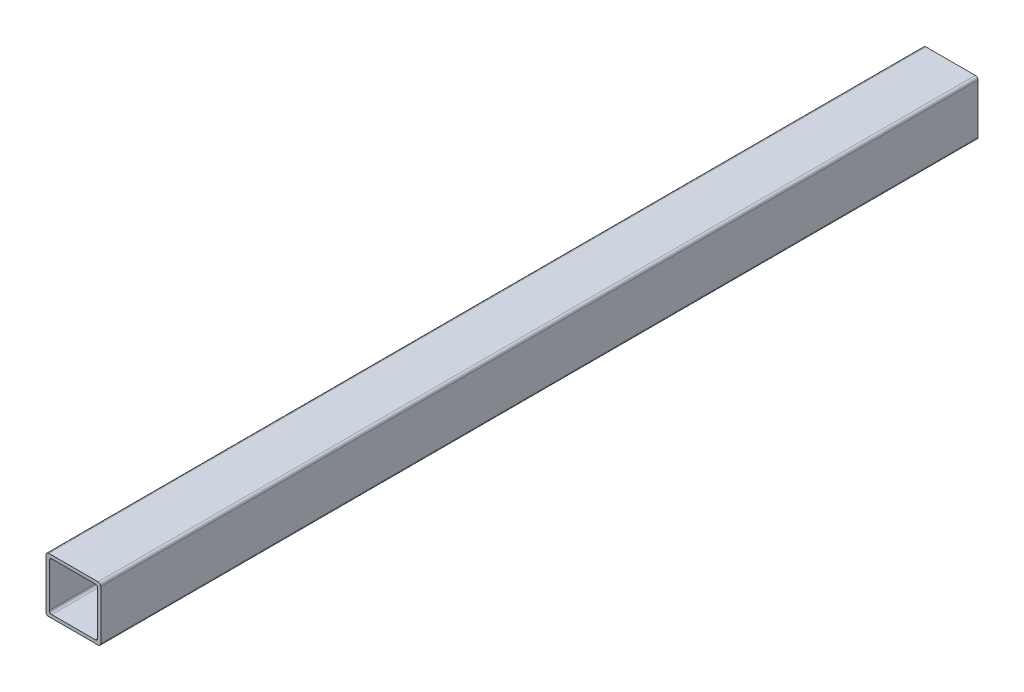
ISO-10303-21;
HEADER;
FILE_DESCRIPTION(('STEP AP214'),'2;1');
FILE_NAME('part.step','',(''),(''),'','','');
FILE_SCHEMA(('AUTOMOTIVE_DESIGN { 1 0 10303 214 1 1 1 1 }'));
ENDSEC;
DATA;
#1=APPLICATION_CONTEXT('core data for automotive mechanical design processes');
#2=APPLICATION_PROTOCOL_DEFINITION('international standard','automotive_design',2000,#1);
#3=PRODUCT_CONTEXT('',#1,'mechanical');
#4=PRODUCT('Part','Part','',(#3));
#5=PRODUCT_RELATED_PRODUCT_CATEGORY('part','',(#4));
#6=PRODUCT_DEFINITION_FORMATION('','',#4);
#7=PRODUCT_DEFINITION_CONTEXT('part definition',#1,'design');
#8=PRODUCT_DEFINITION('design','',#6,#7);
#9=PRODUCT_DEFINITION_SHAPE('','',#8);
#10=(LENGTH_UNIT() NAMED_UNIT(*) SI_UNIT(.MILLI.,.METRE.));
#11=(NAMED_UNIT(*) PLANE_ANGLE_UNIT() SI_UNIT($,.RADIAN.));
#12=(NAMED_UNIT(*) SI_UNIT($,.STERADIAN.) SOLID_ANGLE_UNIT());
#13=UNCERTAINTY_MEASURE_WITH_UNIT(LENGTH_MEASURE(1.E-05),#10,'distance_accuracy_value','');
#14=(GEOMETRIC_REPRESENTATION_CONTEXT(3) GLOBAL_UNCERTAINTY_ASSIGNED_CONTEXT((#13)) GLOBAL_UNIT_ASSIGNED_CONTEXT((#10,
#11,#12)) REPRESENTATION_CONTEXT('',''));
#15=CARTESIAN_POINT('',(0.,0.,0.));
#16=DIRECTION('',(0.,0.,1.));
#17=DIRECTION('',(1.,0.,0.));
#18=AXIS2_PLACEMENT_3D('',#15,#16,#17);
#19=CARTESIAN_POINT('',(22.86,-22.86,-406.4));
#20=DIRECTION('',(0.,0.,1.));
#21=DIRECTION('',(1.,0.,0.));
#22=AXIS2_PLACEMENT_3D('',#19,#20,#21);
#23=CYLINDRICAL_SURFACE('',#22,2.54);
#24=CARTESIAN_POINT('',(22.86,-22.86,406.4));
#25=DIRECTION('',(0.,0.,1.));
#26=DIRECTION('',(1.,0.,0.));
#27=AXIS2_PLACEMENT_3D('',#24,#25,#26);
#28=CIRCLE('',#27,2.54);
#29=CARTESIAN_POINT('',(22.86,-25.4,406.4));
#30=VERTEX_POINT('',#29);
#31=CARTESIAN_POINT('',(25.4,-22.86,406.4));
#32=VERTEX_POINT('',#31);
#33=EDGE_CURVE('E204',#30,#32,#28,.T.);
#34=ORIENTED_EDGE('',*,*,#33,.F.);
#35=DIRECTION('',(0.,0.,1.));
#36=VECTOR('',#35,1.);
#37=CARTESIAN_POINT('',(22.86,-25.4,-406.4));
#38=LINE('',#37,#36);
#39=CARTESIAN_POINT('',(22.86,-25.4,-406.4));
#40=VERTEX_POINT('',#39);
#41=EDGE_CURVE('E11',#40,#30,#38,.T.);
#42=ORIENTED_EDGE('',*,*,#41,.F.);
#43=CARTESIAN_POINT('',(22.86,-22.86,-406.4));
#44=DIRECTION('',(0.,0.,1.));
#45=DIRECTION('',(1.,0.,0.));
#46=AXIS2_PLACEMENT_3D('',#43,#44,#45);
#47=CIRCLE('',#46,2.54);
#48=CARTESIAN_POINT('',(25.4,-22.86,-406.4));
#49=VERTEX_POINT('',#48);
#50=EDGE_CURVE('E216',#40,#49,#47,.T.);
#51=ORIENTED_EDGE('',*,*,#50,.T.);
#52=DIRECTION('',(0.,0.,1.));
#53=VECTOR('',#52,1.);
#54=CARTESIAN_POINT('',(25.4,-22.86,-406.4));
#55=LINE('',#54,#53);
#56=EDGE_CURVE('E37',#49,#32,#55,.T.);
#57=ORIENTED_EDGE('',*,*,#56,.T.);
#58=EDGE_LOOP('',(#34,#42,#51,#57));
#59=FACE_BOUND('',#58,.T.);
#60=ADVANCED_FACE('F34',(#59),#23,.T.);
#61=CARTESIAN_POINT('',(-22.86,-25.4,-406.4));
#62=DIRECTION('',(0.,-1.,0.));
#63=DIRECTION('',(0.,0.,-1.));
#64=AXIS2_PLACEMENT_3D('',#61,#62,#63);
#65=PLANE('',#64);
#66=DIRECTION('',(1.,0.,0.));
#67=VECTOR('',#66,1.);
#68=CARTESIAN_POINT('',(-22.86,-25.4,406.4));
#69=LINE('',#68,#67);
#70=CARTESIAN_POINT('',(-22.86,-25.4,406.4));
#71=VERTEX_POINT('',#70);
#72=EDGE_CURVE('E220',#71,#30,#69,.T.);
#73=ORIENTED_EDGE('',*,*,#72,.F.);
#74=DIRECTION('',(0.,0.,1.));
#75=VECTOR('',#74,1.);
#76=CARTESIAN_POINT('',(-22.86,-25.4,-406.4));
#77=LINE('',#76,#75);
#78=CARTESIAN_POINT('',(-22.86,-25.4,-406.4));
#79=VERTEX_POINT('',#78);
#80=EDGE_CURVE('E42',#79,#71,#77,.T.);
#81=ORIENTED_EDGE('',*,*,#80,.F.);
#82=DIRECTION('',(1.,0.,0.));
#83=VECTOR('',#82,1.);
#84=CARTESIAN_POINT('',(-22.86,-25.4,-406.4));
#85=LINE('',#84,#83);
#86=EDGE_CURVE('E238',#79,#40,#85,.T.);
#87=ORIENTED_EDGE('',*,*,#86,.T.);
#88=ORIENTED_EDGE('',*,*,#41,.T.);
#89=EDGE_LOOP('',(#73,#81,#87,#88));
#90=FACE_BOUND('',#89,.T.);
#91=ADVANCED_FACE('F285',(#90),#65,.T.);
#92=CARTESIAN_POINT('',(-22.86,-22.86,-406.4));
#93=DIRECTION('',(0.,0.,1.));
#94=DIRECTION('',(1.,0.,0.));
#95=AXIS2_PLACEMENT_3D('',#92,#93,#94);
#96=CYLINDRICAL_SURFACE('',#95,2.54);
#97=CARTESIAN_POINT('',(-22.86,-22.86,406.4));
#98=DIRECTION('',(0.,0.,1.));
#99=DIRECTION('',(1.,0.,0.));
#100=AXIS2_PLACEMENT_3D('',#97,#98,#99);
#101=CIRCLE('',#100,2.54);
#102=CARTESIAN_POINT('',(-25.4,-22.86,406.4));
#103=VERTEX_POINT('',#102);
#104=EDGE_CURVE('E258',#103,#71,#101,.T.);
#105=ORIENTED_EDGE('',*,*,#104,.F.);
#106=DIRECTION('',(0.,0.,1.));
#107=VECTOR('',#106,1.);
#108=CARTESIAN_POINT('',(-25.4,-22.86,-406.4));
#109=LINE('',#108,#107);
#110=CARTESIAN_POINT('',(-25.4,-22.86,-406.4));
#111=VERTEX_POINT('',#110);
#112=EDGE_CURVE('E264',#111,#103,#109,.T.);
#113=ORIENTED_EDGE('',*,*,#112,.F.);
#114=CARTESIAN_POINT('',(-22.86,-22.86,-406.4));
#115=DIRECTION('',(0.,0.,1.));
#116=DIRECTION('',(1.,0.,0.));
#117=AXIS2_PLACEMENT_3D('',#114,#115,#116);
#118=CIRCLE('',#117,2.54);
#119=EDGE_CURVE('E235',#111,#79,#118,.T.);
#120=ORIENTED_EDGE('',*,*,#119,.T.);
#121=ORIENTED_EDGE('',*,*,#80,.T.);
#122=EDGE_LOOP('',(#105,#113,#120,#121));
#123=FACE_BOUND('',#122,.T.);
#124=ADVANCED_FACE('F304',(#123),#96,.T.);
#125=CARTESIAN_POINT('',(-25.4,22.86,-406.4));
#126=DIRECTION('',(-1.,0.,0.));
#127=DIRECTION('',(0.,0.,1.));
#128=AXIS2_PLACEMENT_3D('',#125,#126,#127);
#129=PLANE('',#128);
#130=DIRECTION('',(0.,-1.,0.));
#131=VECTOR('',#130,1.);
#132=CARTESIAN_POINT('',(-25.4,22.86,406.4));
#133=LINE('',#132,#131);
#134=CARTESIAN_POINT('',(-25.4,22.86,406.4));
#135=VERTEX_POINT('',#134);
#136=EDGE_CURVE('E255',#135,#103,#133,.T.);
#137=ORIENTED_EDGE('',*,*,#136,.F.);
#138=DIRECTION('',(0.,0.,1.));
#139=VECTOR('',#138,1.);
#140=CARTESIAN_POINT('',(-25.4,22.86,-406.4));
#141=LINE('',#140,#139);
#142=CARTESIAN_POINT('',(-25.4,22.86,-406.4));
#143=VERTEX_POINT('',#142);
#144=EDGE_CURVE('E266',#143,#135,#141,.T.);
#145=ORIENTED_EDGE('',*,*,#144,.F.);
#146=DIRECTION('',(0.,-1.,0.));
#147=VECTOR('',#146,1.);
#148=CARTESIAN_POINT('',(-25.4,22.86,-406.4));
#149=LINE('',#148,#147);
#150=EDGE_CURVE('E232',#143,#111,#149,.T.);
#151=ORIENTED_EDGE('',*,*,#150,.T.);
#152=ORIENTED_EDGE('',*,*,#112,.T.);
#153=EDGE_LOOP('',(#137,#145,#151,#152));
#154=FACE_BOUND('',#153,.T.);
#155=ADVANCED_FACE('F302',(#154),#129,.T.);
#156=CARTESIAN_POINT('',(-22.86,22.86,-406.4));
#157=DIRECTION('',(0.,0.,1.));
#158=DIRECTION('',(1.,0.,0.));
#159=AXIS2_PLACEMENT_3D('',#156,#157,#158);
#160=CYLINDRICAL_SURFACE('',#159,2.54);
#161=CARTESIAN_POINT('',(-22.86,22.86,406.4));
#162=DIRECTION('',(0.,0.,1.));
#163=DIRECTION('',(1.,0.,0.));
#164=AXIS2_PLACEMENT_3D('',#161,#162,#163);
#165=CIRCLE('',#164,2.54);
#166=CARTESIAN_POINT('',(-22.86,25.4,406.4));
#167=VERTEX_POINT('',#166);
#168=EDGE_CURVE('E252',#167,#135,#165,.T.);
#169=ORIENTED_EDGE('',*,*,#168,.F.);
#170=DIRECTION('',(0.,0.,1.));
#171=VECTOR('',#170,1.);
#172=CARTESIAN_POINT('',(-22.86,25.4,-406.4));
#173=LINE('',#172,#171);
#174=CARTESIAN_POINT('',(-22.86,25.4,-406.4));
#175=VERTEX_POINT('',#174);
#176=EDGE_CURVE('E268',#175,#167,#173,.T.);
#177=ORIENTED_EDGE('',*,*,#176,.F.);
#178=CARTESIAN_POINT('',(-22.86,22.86,-406.4));
#179=DIRECTION('',(0.,0.,1.));
#180=DIRECTION('',(1.,0.,0.));
#181=AXIS2_PLACEMENT_3D('',#178,#179,#180);
#182=CIRCLE('',#181,2.54);
#183=EDGE_CURVE('E229',#175,#143,#182,.T.);
#184=ORIENTED_EDGE('',*,*,#183,.T.);
#185=ORIENTED_EDGE('',*,*,#144,.T.);
#186=EDGE_LOOP('',(#169,#177,#184,#185));
#187=FACE_BOUND('',#186,.T.);
#188=ADVANCED_FACE('F298',(#187),#160,.T.);
#189=CARTESIAN_POINT('',(22.86,25.4,-406.4));
#190=DIRECTION('',(0.,1.,0.));
#191=DIRECTION('',(0.,0.,1.));
#192=AXIS2_PLACEMENT_3D('',#189,#190,#191);
#193=PLANE('',#192);
#194=DIRECTION('',(-1.,0.,0.));
#195=VECTOR('',#194,1.);
#196=CARTESIAN_POINT('',(22.86,25.4,406.4));
#197=LINE('',#196,#195);
#198=CARTESIAN_POINT('',(22.86,25.4,406.4));
#199=VERTEX_POINT('',#198);
#200=EDGE_CURVE('E249',#199,#167,#197,.T.);
#201=ORIENTED_EDGE('',*,*,#200,.F.);
#202=DIRECTION('',(0.,0.,1.));
#203=VECTOR('',#202,1.);
#204=CARTESIAN_POINT('',(22.86,25.4,-406.4));
#205=LINE('',#204,#203);
#206=CARTESIAN_POINT('',(22.86,25.4,-406.4));
#207=VERTEX_POINT('',#206);
#208=EDGE_CURVE('E270',#207,#199,#205,.T.);
#209=ORIENTED_EDGE('',*,*,#208,.F.);
#210=DIRECTION('',(-1.,0.,0.));
#211=VECTOR('',#210,1.);
#212=CARTESIAN_POINT('',(22.86,25.4,-406.4));
#213=LINE('',#212,#211);
#214=EDGE_CURVE('E226',#207,#175,#213,.T.);
#215=ORIENTED_EDGE('',*,*,#214,.T.);
#216=ORIENTED_EDGE('',*,*,#176,.T.);
#217=EDGE_LOOP('',(#201,#209,#215,#216));
#218=FACE_BOUND('',#217,.T.);
#219=ADVANCED_FACE('F296',(#218),#193,.T.);
#220=CARTESIAN_POINT('',(22.86,22.86,-406.4));
#221=DIRECTION('',(0.,0.,1.));
#222=DIRECTION('',(1.,0.,0.));
#223=AXIS2_PLACEMENT_3D('',#220,#221,#222);
#224=CYLINDRICAL_SURFACE('',#223,2.54);
#225=CARTESIAN_POINT('',(22.86,22.86,406.4));
#226=DIRECTION('',(0.,0.,1.));
#227=DIRECTION('',(1.,0.,0.));
#228=AXIS2_PLACEMENT_3D('',#225,#226,#227);
#229=CIRCLE('',#228,2.54);
#230=CARTESIAN_POINT('',(25.4,22.86,406.4));
#231=VERTEX_POINT('',#230);
#232=EDGE_CURVE('E246',#231,#199,#229,.T.);
#233=ORIENTED_EDGE('',*,*,#232,.F.);
#234=DIRECTION('',(0.,0.,1.));
#235=VECTOR('',#234,1.);
#236=CARTESIAN_POINT('',(25.4,22.86,-406.4));
#237=LINE('',#236,#235);
#238=CARTESIAN_POINT('',(25.4,22.86,-406.4));
#239=VERTEX_POINT('',#238);
#240=EDGE_CURVE('E271',#239,#231,#237,.T.);
#241=ORIENTED_EDGE('',*,*,#240,.F.);
#242=CARTESIAN_POINT('',(22.86,22.86,-406.4));
#243=DIRECTION('',(0.,0.,1.));
#244=DIRECTION('',(1.,0.,0.));
#245=AXIS2_PLACEMENT_3D('',#242,#243,#244);
#246=CIRCLE('',#245,2.54);
#247=EDGE_CURVE('E223',#239,#207,#246,.T.);
#248=ORIENTED_EDGE('',*,*,#247,.T.);
#249=ORIENTED_EDGE('',*,*,#208,.T.);
#250=EDGE_LOOP('',(#233,#241,#248,#249));
#251=FACE_BOUND('',#250,.T.);
#252=ADVANCED_FACE('F292',(#251),#224,.T.);
#253=CARTESIAN_POINT('',(25.4,-22.86,-406.4));
#254=DIRECTION('',(1.,0.,0.));
#255=DIRECTION('',(0.,0.,-1.));
#256=AXIS2_PLACEMENT_3D('',#253,#254,#255);
#257=PLANE('',#256);
#258=DIRECTION('',(0.,1.,0.));
#259=VECTOR('',#258,1.);
#260=CARTESIAN_POINT('',(25.4,-22.86,406.4));
#261=LINE('',#260,#259);
#262=EDGE_CURVE('E243',#32,#231,#261,.T.);
#263=ORIENTED_EDGE('',*,*,#262,.F.);
#264=ORIENTED_EDGE('',*,*,#56,.F.);
#265=DIRECTION('',(0.,1.,0.));
#266=VECTOR('',#265,1.);
#267=CARTESIAN_POINT('',(25.4,-22.86,-406.4));
#268=LINE('',#267,#266);
#269=EDGE_CURVE('E219',#49,#239,#268,.T.);
#270=ORIENTED_EDGE('',*,*,#269,.T.);
#271=ORIENTED_EDGE('',*,*,#240,.T.);
#272=EDGE_LOOP('',(#263,#264,#270,#271));
#273=FACE_BOUND('',#272,.T.);
#274=ADVANCED_FACE('F279',(#273),#257,.T.);
#275=CARTESIAN_POINT('',(22.86,-22.86,-406.4));
#276=DIRECTION('',(0.,0.,1.));
#277=DIRECTION('',(1.,0.,0.));
#278=AXIS2_PLACEMENT_3D('',#275,#276,#277);
#279=PLANE('',#278);
#280=DIRECTION('',(-1.,0.,0.));
#281=VECTOR('',#280,1.);
#282=CARTESIAN_POINT('',(-20.1168,22.352,-406.4));
#283=LINE('',#282,#281);
#284=CARTESIAN_POINT('',(20.1168,22.352,-406.4));
#285=VERTEX_POINT('',#284);
#286=CARTESIAN_POINT('',(-20.1168,22.352,-406.4));
#287=VERTEX_POINT('',#286);
#288=EDGE_CURVE('E155',#285,#287,#283,.T.);
#289=ORIENTED_EDGE('',*,*,#288,.T.);
#290=CARTESIAN_POINT('',(-20.1168,20.1168,-406.4));
#291=DIRECTION('',(0.,0.,1.));
#292=DIRECTION('',(-1.,0.,0.));
#293=AXIS2_PLACEMENT_3D('',#290,#291,#292);
#294=CIRCLE('',#293,2.2352);
#295=CARTESIAN_POINT('',(-22.352,20.1168,-406.4));
#296=VERTEX_POINT('',#295);
#297=EDGE_CURVE('E149',#287,#296,#294,.T.);
#298=ORIENTED_EDGE('',*,*,#297,.T.);
#299=DIRECTION('',(0.,-1.,0.));
#300=VECTOR('',#299,1.);
#301=CARTESIAN_POINT('',(-22.352,-20.1168,-406.4));
#302=LINE('',#301,#300);
#303=CARTESIAN_POINT('',(-22.352,-20.1168,-406.4));
#304=VERTEX_POINT('',#303);
#305=EDGE_CURVE('E158',#296,#304,#302,.T.);
#306=ORIENTED_EDGE('',*,*,#305,.T.);
#307=CARTESIAN_POINT('',(-20.1168,-20.1168,-406.4));
#308=DIRECTION('',(0.,0.,1.));
#309=DIRECTION('',(-1.,0.,0.));
#310=AXIS2_PLACEMENT_3D('',#307,#308,#309);
#311=CIRCLE('',#310,2.2352);
#312=CARTESIAN_POINT('',(-20.1168,-22.352,-406.4));
#313=VERTEX_POINT('',#312);
#314=EDGE_CURVE('E50',#304,#313,#311,.T.);
#315=ORIENTED_EDGE('',*,*,#314,.T.);
#316=DIRECTION('',(1.,0.,0.));
#317=VECTOR('',#316,1.);
#318=CARTESIAN_POINT('',(20.1168,-22.352,-406.4));
#319=LINE('',#318,#317);
#320=CARTESIAN_POINT('',(20.1168,-22.352,-406.4));
#321=VERTEX_POINT('',#320);
#322=EDGE_CURVE('E173',#313,#321,#319,.T.);
#323=ORIENTED_EDGE('',*,*,#322,.T.);
#324=CARTESIAN_POINT('',(20.1168,-20.1168,-406.4));
#325=DIRECTION('',(0.,0.,1.));
#326=DIRECTION('',(-1.,0.,0.));
#327=AXIS2_PLACEMENT_3D('',#324,#325,#326);
#328=CIRCLE('',#327,2.2352);
#329=CARTESIAN_POINT('',(22.352,-20.1168,-406.4));
#330=VERTEX_POINT('',#329);
#331=EDGE_CURVE('E176',#321,#330,#328,.T.);
#332=ORIENTED_EDGE('',*,*,#331,.T.);
#333=DIRECTION('',(0.,1.,0.));
#334=VECTOR('',#333,1.);
#335=CARTESIAN_POINT('',(22.352,20.1168,-406.4));
#336=LINE('',#335,#334);
#337=CARTESIAN_POINT('',(22.352,20.1168,-406.4));
#338=VERTEX_POINT('',#337);
#339=EDGE_CURVE('E179',#330,#338,#336,.T.);
#340=ORIENTED_EDGE('',*,*,#339,.T.);
#341=CARTESIAN_POINT('',(20.1168,20.1168,-406.4));
#342=DIRECTION('',(0.,0.,1.));
#343=DIRECTION('',(-1.,0.,0.));
#344=AXIS2_PLACEMENT_3D('',#341,#342,#343);
#345=CIRCLE('',#344,2.2352);
#346=EDGE_CURVE('E182',#338,#285,#345,.T.);
#347=ORIENTED_EDGE('',*,*,#346,.T.);
#348=EDGE_LOOP('',(#289,#298,#306,#315,#323,#332,#340,#347));
#349=FACE_BOUND('',#348,.T.);
#350=ORIENTED_EDGE('',*,*,#50,.F.);
#351=ORIENTED_EDGE('',*,*,#86,.F.);
#352=ORIENTED_EDGE('',*,*,#119,.F.);
#353=ORIENTED_EDGE('',*,*,#150,.F.);
#354=ORIENTED_EDGE('',*,*,#183,.F.);
#355=ORIENTED_EDGE('',*,*,#214,.F.);
#356=ORIENTED_EDGE('',*,*,#247,.F.);
#357=ORIENTED_EDGE('',*,*,#269,.F.);
#358=EDGE_LOOP('',(#350,#351,#352,#353,#354,#355,#356,#357));
#359=FACE_BOUND('',#358,.T.);
#360=ADVANCED_FACE('F162',(#349,#359),#279,.F.);
#361=CARTESIAN_POINT('',(22.86,-22.86,406.4));
#362=DIRECTION('',(0.,0.,1.));
#363=DIRECTION('',(1.,0.,0.));
#364=AXIS2_PLACEMENT_3D('',#361,#362,#363);
#365=PLANE('',#364);
#366=CARTESIAN_POINT('',(-20.1168,20.1168,406.4));
#367=DIRECTION('',(0.,0.,1.));
#368=DIRECTION('',(-1.,0.,0.));
#369=AXIS2_PLACEMENT_3D('',#366,#367,#368);
#370=CIRCLE('',#369,2.2352);
#371=CARTESIAN_POINT('',(-20.1168,22.352,406.4));
#372=VERTEX_POINT('',#371);
#373=CARTESIAN_POINT('',(-22.352,20.1168,406.4));
#374=VERTEX_POINT('',#373);
#375=EDGE_CURVE('E58',#372,#374,#370,.T.);
#376=ORIENTED_EDGE('',*,*,#375,.F.);
#377=DIRECTION('',(-1.,0.,0.));
#378=VECTOR('',#377,1.);
#379=CARTESIAN_POINT('',(-20.1168,22.352,406.4));
#380=LINE('',#379,#378);
#381=CARTESIAN_POINT('',(20.1168,22.352,406.4));
#382=VERTEX_POINT('',#381);
#383=EDGE_CURVE('E166',#382,#372,#380,.T.);
#384=ORIENTED_EDGE('',*,*,#383,.F.);
#385=CARTESIAN_POINT('',(20.1168,20.1168,406.4));
#386=DIRECTION('',(0.,0.,1.));
#387=DIRECTION('',(-1.,0.,0.));
#388=AXIS2_PLACEMENT_3D('',#385,#386,#387);
#389=CIRCLE('',#388,2.2352);
#390=CARTESIAN_POINT('',(22.352,20.1168,406.4));
#391=VERTEX_POINT('',#390);
#392=EDGE_CURVE('E169',#391,#382,#389,.T.);
#393=ORIENTED_EDGE('',*,*,#392,.F.);
#394=DIRECTION('',(0.,1.,0.));
#395=VECTOR('',#394,1.);
#396=CARTESIAN_POINT('',(22.352,20.1168,406.4));
#397=LINE('',#396,#395);
#398=CARTESIAN_POINT('',(22.352,-20.1168,406.4));
#399=VERTEX_POINT('',#398);
#400=EDGE_CURVE('E197',#399,#391,#397,.T.);
#401=ORIENTED_EDGE('',*,*,#400,.F.);
#402=CARTESIAN_POINT('',(20.1168,-20.1168,406.4));
#403=DIRECTION('',(0.,0.,1.));
#404=DIRECTION('',(-1.,0.,0.));
#405=AXIS2_PLACEMENT_3D('',#402,#403,#404);
#406=CIRCLE('',#405,2.2352);
#407=CARTESIAN_POINT('',(20.1168,-22.352,406.4));
#408=VERTEX_POINT('',#407);
#409=EDGE_CURVE('E194',#408,#399,#406,.T.);
#410=ORIENTED_EDGE('',*,*,#409,.F.);
#411=DIRECTION('',(1.,0.,0.));
#412=VECTOR('',#411,1.);
#413=CARTESIAN_POINT('',(20.1168,-22.352,406.4));
#414=LINE('',#413,#412);
#415=CARTESIAN_POINT('',(-20.1168,-22.352,406.4));
#416=VERTEX_POINT('',#415);
#417=EDGE_CURVE('E191',#416,#408,#414,.T.);
#418=ORIENTED_EDGE('',*,*,#417,.F.);
#419=CARTESIAN_POINT('',(-20.1168,-20.1168,406.4));
#420=DIRECTION('',(0.,0.,1.));
#421=DIRECTION('',(-1.,0.,0.));
#422=AXIS2_PLACEMENT_3D('',#419,#420,#421);
#423=CIRCLE('',#422,2.2352);
#424=CARTESIAN_POINT('',(-22.352,-20.1168,406.4));
#425=VERTEX_POINT('',#424);
#426=EDGE_CURVE('E188',#425,#416,#423,.T.);
#427=ORIENTED_EDGE('',*,*,#426,.F.);
#428=DIRECTION('',(0.,-1.,0.));
#429=VECTOR('',#428,1.);
#430=CARTESIAN_POINT('',(-22.352,-20.1168,406.4));
#431=LINE('',#430,#429);
#432=EDGE_CURVE('E186',#374,#425,#431,.T.);
#433=ORIENTED_EDGE('',*,*,#432,.F.);
#434=EDGE_LOOP('',(#376,#384,#393,#401,#410,#418,#427,#433));
#435=FACE_BOUND('',#434,.T.);
#436=ORIENTED_EDGE('',*,*,#33,.T.);
#437=ORIENTED_EDGE('',*,*,#262,.T.);
#438=ORIENTED_EDGE('',*,*,#232,.T.);
#439=ORIENTED_EDGE('',*,*,#200,.T.);
#440=ORIENTED_EDGE('',*,*,#168,.T.);
#441=ORIENTED_EDGE('',*,*,#136,.T.);
#442=ORIENTED_EDGE('',*,*,#104,.T.);
#443=ORIENTED_EDGE('',*,*,#72,.T.);
#444=EDGE_LOOP('',(#436,#437,#438,#439,#440,#441,#442,#443));
#445=FACE_BOUND('',#444,.T.);
#446=ADVANCED_FACE('F281',(#435,#445),#365,.T.);
#447=CARTESIAN_POINT('',(-20.1168,20.1168,-406.4));
#448=DIRECTION('',(0.,0.,1.));
#449=DIRECTION('',(1.,0.,0.));
#450=AXIS2_PLACEMENT_3D('',#447,#448,#449);
#451=CYLINDRICAL_SURFACE('',#450,2.2352);
#452=ORIENTED_EDGE('',*,*,#375,.T.);
#453=DIRECTION('',(0.,0.,1.));
#454=VECTOR('',#453,1.);
#455=CARTESIAN_POINT('',(-22.352,20.1168,-406.4));
#456=LINE('',#455,#454);
#457=EDGE_CURVE('E145',#296,#374,#456,.T.);
#458=ORIENTED_EDGE('',*,*,#457,.F.);
#459=ORIENTED_EDGE('',*,*,#297,.F.);
#460=DIRECTION('',(0.,0.,1.));
#461=VECTOR('',#460,1.);
#462=CARTESIAN_POINT('',(-20.1168,22.352,-406.4));
#463=LINE('',#462,#461);
#464=EDGE_CURVE('E202',#287,#372,#463,.T.);
#465=ORIENTED_EDGE('',*,*,#464,.T.);
#466=EDGE_LOOP('',(#452,#458,#459,#465));
#467=FACE_BOUND('',#466,.T.);
#468=ADVANCED_FACE('F147',(#467),#451,.F.);
#469=CARTESIAN_POINT('',(-20.1168,22.352,-406.4));
#470=DIRECTION('',(0.,1.,0.));
#471=DIRECTION('',(0.,0.,1.));
#472=AXIS2_PLACEMENT_3D('',#469,#470,#471);
#473=PLANE('',#472);
#474=ORIENTED_EDGE('',*,*,#383,.T.);
#475=ORIENTED_EDGE('',*,*,#464,.F.);
#476=ORIENTED_EDGE('',*,*,#288,.F.);
#477=DIRECTION('',(0.,0.,1.));
#478=VECTOR('',#477,1.);
#479=CARTESIAN_POINT('',(20.1168,22.352,-406.4));
#480=LINE('',#479,#478);
#481=EDGE_CURVE('E205',#285,#382,#480,.T.);
#482=ORIENTED_EDGE('',*,*,#481,.T.);
#483=EDGE_LOOP('',(#474,#475,#476,#482));
#484=FACE_BOUND('',#483,.T.);
#485=ADVANCED_FACE('F387',(#484),#473,.F.);
#486=CARTESIAN_POINT('',(20.1168,20.1168,-406.4));
#487=DIRECTION('',(0.,0.,1.));
#488=DIRECTION('',(1.,0.,0.));
#489=AXIS2_PLACEMENT_3D('',#486,#487,#488);
#490=CYLINDRICAL_SURFACE('',#489,2.2352);
#491=ORIENTED_EDGE('',*,*,#392,.T.);
#492=ORIENTED_EDGE('',*,*,#481,.F.);
#493=ORIENTED_EDGE('',*,*,#346,.F.);
#494=DIRECTION('',(0.,0.,1.));
#495=VECTOR('',#494,1.);
#496=CARTESIAN_POINT('',(22.352,20.1168,-406.4));
#497=LINE('',#496,#495);
#498=EDGE_CURVE('E207',#338,#391,#497,.T.);
#499=ORIENTED_EDGE('',*,*,#498,.T.);
#500=EDGE_LOOP('',(#491,#492,#493,#499));
#501=FACE_BOUND('',#500,.T.);
#502=ADVANCED_FACE('F396',(#501),#490,.F.);
#503=CARTESIAN_POINT('',(22.352,20.1168,-406.4));
#504=DIRECTION('',(1.,0.,0.));
#505=DIRECTION('',(0.,0.,-1.));
#506=AXIS2_PLACEMENT_3D('',#503,#504,#505);
#507=PLANE('',#506);
#508=ORIENTED_EDGE('',*,*,#400,.T.);
#509=ORIENTED_EDGE('',*,*,#498,.F.);
#510=ORIENTED_EDGE('',*,*,#339,.F.);
#511=DIRECTION('',(0.,0.,1.));
#512=VECTOR('',#511,1.);
#513=CARTESIAN_POINT('',(22.352,-20.1168,-406.4));
#514=LINE('',#513,#512);
#515=EDGE_CURVE('E209',#330,#399,#514,.T.);
#516=ORIENTED_EDGE('',*,*,#515,.T.);
#517=EDGE_LOOP('',(#508,#509,#510,#516));
#518=FACE_BOUND('',#517,.T.);
#519=ADVANCED_FACE('F406',(#518),#507,.F.);
#520=CARTESIAN_POINT('',(20.1168,-20.1168,-406.4));
#521=DIRECTION('',(0.,0.,1.));
#522=DIRECTION('',(1.,0.,0.));
#523=AXIS2_PLACEMENT_3D('',#520,#521,#522);
#524=CYLINDRICAL_SURFACE('',#523,2.2352);
#525=ORIENTED_EDGE('',*,*,#409,.T.);
#526=ORIENTED_EDGE('',*,*,#515,.F.);
#527=ORIENTED_EDGE('',*,*,#331,.F.);
#528=DIRECTION('',(0.,0.,1.));
#529=VECTOR('',#528,1.);
#530=CARTESIAN_POINT('',(20.1168,-22.352,-406.4));
#531=LINE('',#530,#529);
#532=EDGE_CURVE('E211',#321,#408,#531,.T.);
#533=ORIENTED_EDGE('',*,*,#532,.T.);
#534=EDGE_LOOP('',(#525,#526,#527,#533));
#535=FACE_BOUND('',#534,.T.);
#536=ADVANCED_FACE('F416',(#535),#524,.F.);
#537=CARTESIAN_POINT('',(20.1168,-22.352,-406.4));
#538=DIRECTION('',(0.,-1.,0.));
#539=DIRECTION('',(0.,0.,-1.));
#540=AXIS2_PLACEMENT_3D('',#537,#538,#539);
#541=PLANE('',#540);
#542=ORIENTED_EDGE('',*,*,#417,.T.);
#543=ORIENTED_EDGE('',*,*,#532,.F.);
#544=ORIENTED_EDGE('',*,*,#322,.F.);
#545=DIRECTION('',(0.,0.,1.));
#546=VECTOR('',#545,1.);
#547=CARTESIAN_POINT('',(-20.1168,-22.352,-406.4));
#548=LINE('',#547,#546);
#549=EDGE_CURVE('E213',#313,#416,#548,.T.);
#550=ORIENTED_EDGE('',*,*,#549,.T.);
#551=EDGE_LOOP('',(#542,#543,#544,#550));
#552=FACE_BOUND('',#551,.T.);
#553=ADVANCED_FACE('F426',(#552),#541,.F.);
#554=CARTESIAN_POINT('',(-20.1168,-20.1168,-406.4));
#555=DIRECTION('',(0.,0.,1.));
#556=DIRECTION('',(1.,0.,0.));
#557=AXIS2_PLACEMENT_3D('',#554,#555,#556);
#558=CYLINDRICAL_SURFACE('',#557,2.2352);
#559=ORIENTED_EDGE('',*,*,#426,.T.);
#560=ORIENTED_EDGE('',*,*,#549,.F.);
#561=ORIENTED_EDGE('',*,*,#314,.F.);
#562=DIRECTION('',(0.,0.,1.));
#563=VECTOR('',#562,1.);
#564=CARTESIAN_POINT('',(-22.352,-20.1168,-406.4));
#565=LINE('',#564,#563);
#566=EDGE_CURVE('E154',#304,#425,#565,.T.);
#567=ORIENTED_EDGE('',*,*,#566,.T.);
#568=EDGE_LOOP('',(#559,#560,#561,#567));
#569=FACE_BOUND('',#568,.T.);
#570=ADVANCED_FACE('F436',(#569),#558,.F.);
#571=CARTESIAN_POINT('',(-22.352,-20.1168,-406.4));
#572=DIRECTION('',(-1.,0.,0.));
#573=DIRECTION('',(0.,0.,1.));
#574=AXIS2_PLACEMENT_3D('',#571,#572,#573);
#575=PLANE('',#574);
#576=ORIENTED_EDGE('',*,*,#432,.T.);
#577=ORIENTED_EDGE('',*,*,#566,.F.);
#578=ORIENTED_EDGE('',*,*,#305,.F.);
#579=ORIENTED_EDGE('',*,*,#457,.T.);
#580=EDGE_LOOP('',(#576,#577,#578,#579));
#581=FACE_BOUND('',#580,.T.);
#582=ADVANCED_FACE('F159',(#581),#575,.F.);
#583=CLOSED_SHELL('',(#60,#91,#124,#155,#188,#219,#252,#274,#360,#446,#468,#485,#502,#519,#536,
#553,#570,#582));
#584=MANIFOLD_SOLID_BREP('B2',#583);
#585=ADVANCED_BREP_SHAPE_REPRESENTATION('',(#18,#584),#14);
#586=SHAPE_DEFINITION_REPRESENTATION(#9,#585);
ENDSEC;
END-ISO-10303-21;
